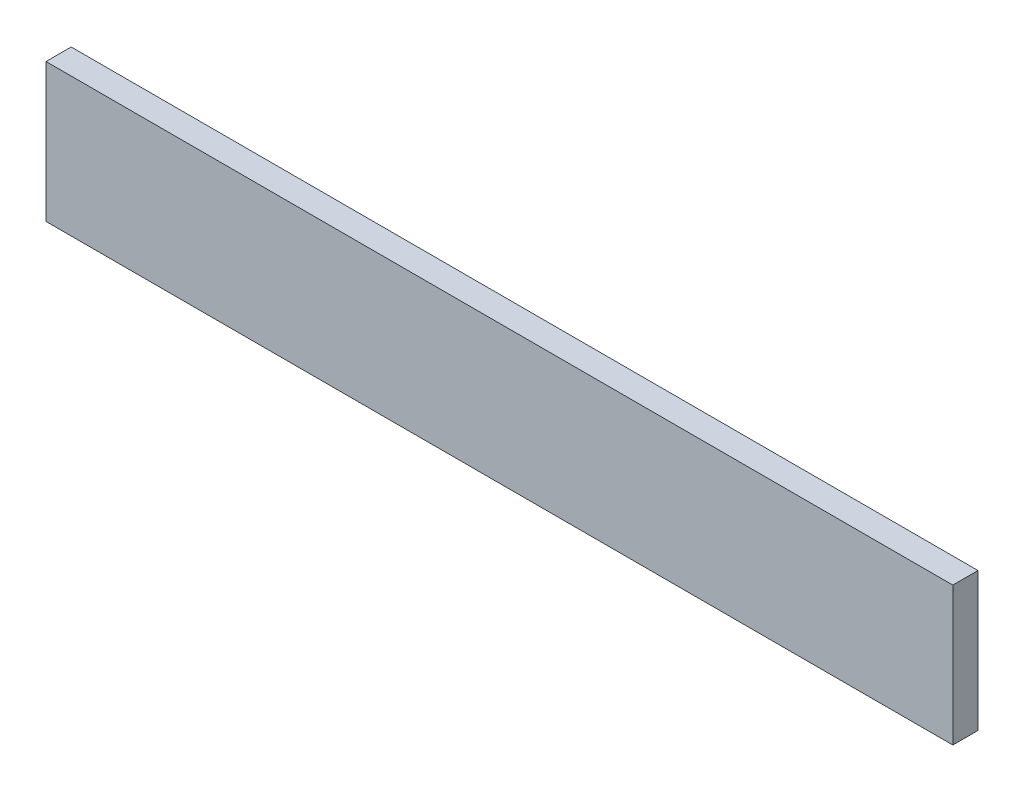
ISO-10303-21;
HEADER;
FILE_DESCRIPTION(('STEP AP214'),'2;1');
FILE_NAME('part.step','',(''),(''),'','','');
FILE_SCHEMA(('AUTOMOTIVE_DESIGN { 1 0 10303 214 1 1 1 1 }'));
ENDSEC;
DATA;
#1=APPLICATION_CONTEXT('core data for automotive mechanical design processes');
#2=APPLICATION_PROTOCOL_DEFINITION('international standard','automotive_design',2000,#1);
#3=PRODUCT_CONTEXT('',#1,'mechanical');
#4=PRODUCT('Part','Part','',(#3));
#5=PRODUCT_RELATED_PRODUCT_CATEGORY('part','',(#4));
#6=PRODUCT_DEFINITION_FORMATION('','',#4);
#7=PRODUCT_DEFINITION_CONTEXT('part definition',#1,'design');
#8=PRODUCT_DEFINITION('design','',#6,#7);
#9=PRODUCT_DEFINITION_SHAPE('','',#8);
#10=(LENGTH_UNIT() NAMED_UNIT(*) SI_UNIT(.MILLI.,.METRE.));
#11=(NAMED_UNIT(*) PLANE_ANGLE_UNIT() SI_UNIT($,.RADIAN.));
#12=(NAMED_UNIT(*) SI_UNIT($,.STERADIAN.) SOLID_ANGLE_UNIT());
#13=UNCERTAINTY_MEASURE_WITH_UNIT(LENGTH_MEASURE(1.E-05),#10,'distance_accuracy_value','');
#14=(GEOMETRIC_REPRESENTATION_CONTEXT(3) GLOBAL_UNCERTAINTY_ASSIGNED_CONTEXT((#13)) GLOBAL_UNIT_ASSIGNED_CONTEXT((#10,
#11,#12)) REPRESENTATION_CONTEXT('',''));
#15=CARTESIAN_POINT('',(0.,0.,0.));
#16=DIRECTION('',(0.,0.,1.));
#17=DIRECTION('',(1.,0.,0.));
#18=AXIS2_PLACEMENT_3D('',#15,#16,#17);
#19=CARTESIAN_POINT('',(228.6,34.925,12.7));
#20=DIRECTION('',(1.,0.,0.));
#21=DIRECTION('',(0.,1.,0.));
#22=AXIS2_PLACEMENT_3D('',#19,#20,#21);
#23=PLANE('',#22);
#24=DIRECTION('',(0.,-1.,0.));
#25=VECTOR('',#24,1.);
#26=CARTESIAN_POINT('',(228.6,34.925,0.));
#27=LINE('',#26,#25);
#28=CARTESIAN_POINT('',(228.6,34.925,0.));
#29=VERTEX_POINT('',#28);
#30=CARTESIAN_POINT('',(228.6,-34.925,0.));
#31=VERTEX_POINT('',#30);
#32=EDGE_CURVE('E98',#29,#31,#27,.T.);
#33=ORIENTED_EDGE('',*,*,#32,.F.);
#34=DIRECTION('',(0.,0.,-1.));
#35=VECTOR('',#34,1.);
#36=CARTESIAN_POINT('',(228.6,34.925,12.7));
#37=LINE('',#36,#35);
#38=CARTESIAN_POINT('',(228.6,34.925,12.7));
#39=VERTEX_POINT('',#38);
#40=EDGE_CURVE('E11',#39,#29,#37,.T.);
#41=ORIENTED_EDGE('',*,*,#40,.F.);
#42=DIRECTION('',(0.,-1.,0.));
#43=VECTOR('',#42,1.);
#44=CARTESIAN_POINT('',(228.6,34.925,12.7));
#45=LINE('',#44,#43);
#46=CARTESIAN_POINT('',(228.6,-34.925,12.7));
#47=VERTEX_POINT('',#46);
#48=EDGE_CURVE('E93',#39,#47,#45,.T.);
#49=ORIENTED_EDGE('',*,*,#48,.T.);
#50=DIRECTION('',(0.,0.,-1.));
#51=VECTOR('',#50,1.);
#52=CARTESIAN_POINT('',(228.6,-34.925,12.7));
#53=LINE('',#52,#51);
#54=EDGE_CURVE('E36',#47,#31,#53,.T.);
#55=ORIENTED_EDGE('',*,*,#54,.T.);
#56=EDGE_LOOP('',(#33,#41,#49,#55));
#57=FACE_BOUND('',#56,.T.);
#58=ADVANCED_FACE('F33',(#57),#23,.T.);
#59=CARTESIAN_POINT('',(228.6,34.925,12.7));
#60=DIRECTION('',(0.,-1.,0.));
#61=DIRECTION('',(1.,0.,0.));
#62=AXIS2_PLACEMENT_3D('',#59,#60,#61);
#63=PLANE('',#62);
#64=DIRECTION('',(-1.,0.,0.));
#65=VECTOR('',#64,1.);
#66=CARTESIAN_POINT('',(228.6,34.925,0.));
#67=LINE('',#66,#65);
#68=CARTESIAN_POINT('',(-228.6,34.925,0.));
#69=VERTEX_POINT('',#68);
#70=EDGE_CURVE('E66',#29,#69,#67,.T.);
#71=ORIENTED_EDGE('',*,*,#70,.T.);
#72=DIRECTION('',(0.,0.,-1.));
#73=VECTOR('',#72,1.);
#74=CARTESIAN_POINT('',(-228.6,34.925,12.7));
#75=LINE('',#74,#73);
#76=CARTESIAN_POINT('',(-228.6,34.925,12.7));
#77=VERTEX_POINT('',#76);
#78=EDGE_CURVE('E42',#77,#69,#75,.T.);
#79=ORIENTED_EDGE('',*,*,#78,.F.);
#80=DIRECTION('',(-1.,0.,0.));
#81=VECTOR('',#80,1.);
#82=CARTESIAN_POINT('',(228.6,34.925,12.7));
#83=LINE('',#82,#81);
#84=EDGE_CURVE('E83',#39,#77,#83,.T.);
#85=ORIENTED_EDGE('',*,*,#84,.F.);
#86=ORIENTED_EDGE('',*,*,#40,.T.);
#87=EDGE_LOOP('',(#71,#79,#85,#86));
#88=FACE_BOUND('',#87,.T.);
#89=ADVANCED_FACE('F108',(#88),#63,.F.);
#90=CARTESIAN_POINT('',(-228.6,34.925,12.7));
#91=DIRECTION('',(1.,0.,0.));
#92=DIRECTION('',(0.,0.,-1.));
#93=AXIS2_PLACEMENT_3D('',#90,#91,#92);
#94=PLANE('',#93);
#95=DIRECTION('',(0.,-1.,0.));
#96=VECTOR('',#95,1.);
#97=CARTESIAN_POINT('',(-228.6,34.925,0.));
#98=LINE('',#97,#96);
#99=CARTESIAN_POINT('',(-228.6,-34.925,0.));
#100=VERTEX_POINT('',#99);
#101=EDGE_CURVE('E90',#69,#100,#98,.T.);
#102=ORIENTED_EDGE('',*,*,#101,.T.);
#103=DIRECTION('',(0.,0.,-1.));
#104=VECTOR('',#103,1.);
#105=CARTESIAN_POINT('',(-228.6,-34.925,12.7));
#106=LINE('',#105,#104);
#107=CARTESIAN_POINT('',(-228.6,-34.925,12.7));
#108=VERTEX_POINT('',#107);
#109=EDGE_CURVE('E87',#108,#100,#106,.T.);
#110=ORIENTED_EDGE('',*,*,#109,.F.);
#111=DIRECTION('',(0.,-1.,0.));
#112=VECTOR('',#111,1.);
#113=CARTESIAN_POINT('',(-228.6,34.925,12.7));
#114=LINE('',#113,#112);
#115=EDGE_CURVE('E78',#77,#108,#114,.T.);
#116=ORIENTED_EDGE('',*,*,#115,.F.);
#117=ORIENTED_EDGE('',*,*,#78,.T.);
#118=EDGE_LOOP('',(#102,#110,#116,#117));
#119=FACE_BOUND('',#118,.T.);
#120=ADVANCED_FACE('F88',(#119),#94,.F.);
#121=CARTESIAN_POINT('',(228.6,-34.925,12.7));
#122=DIRECTION('',(0.,-1.,0.));
#123=DIRECTION('',(1.,0.,0.));
#124=AXIS2_PLACEMENT_3D('',#121,#122,#123);
#125=PLANE('',#124);
#126=DIRECTION('',(-1.,0.,0.));
#127=VECTOR('',#126,1.);
#128=CARTESIAN_POINT('',(228.6,-34.925,0.));
#129=LINE('',#128,#127);
#130=EDGE_CURVE('E101',#31,#100,#129,.T.);
#131=ORIENTED_EDGE('',*,*,#130,.F.);
#132=ORIENTED_EDGE('',*,*,#54,.F.);
#133=DIRECTION('',(-1.,0.,0.));
#134=VECTOR('',#133,1.);
#135=CARTESIAN_POINT('',(228.6,-34.925,12.7));
#136=LINE('',#135,#134);
#137=EDGE_CURVE('E82',#47,#108,#136,.T.);
#138=ORIENTED_EDGE('',*,*,#137,.T.);
#139=ORIENTED_EDGE('',*,*,#109,.T.);
#140=EDGE_LOOP('',(#131,#132,#138,#139));
#141=FACE_BOUND('',#140,.T.);
#142=ADVANCED_FACE('F92',(#141),#125,.T.);
#143=CARTESIAN_POINT('',(0.,0.,12.7));
#144=DIRECTION('',(0.,0.,-1.));
#145=DIRECTION('',(-1.,0.,0.));
#146=AXIS2_PLACEMENT_3D('',#143,#144,#145);
#147=PLANE('',#146);
#148=ORIENTED_EDGE('',*,*,#48,.F.);
#149=ORIENTED_EDGE('',*,*,#84,.T.);
#150=ORIENTED_EDGE('',*,*,#115,.T.);
#151=ORIENTED_EDGE('',*,*,#137,.F.);
#152=EDGE_LOOP('',(#148,#149,#150,#151));
#153=FACE_BOUND('',#152,.T.);
#154=ADVANCED_FACE('F81',(#153),#147,.F.);
#155=CARTESIAN_POINT('',(0.,0.,0.));
#156=DIRECTION('',(0.,0.,-1.));
#157=DIRECTION('',(-1.,0.,0.));
#158=AXIS2_PLACEMENT_3D('',#155,#156,#157);
#159=PLANE('',#158);
#160=ORIENTED_EDGE('',*,*,#32,.T.);
#161=ORIENTED_EDGE('',*,*,#130,.T.);
#162=ORIENTED_EDGE('',*,*,#101,.F.);
#163=ORIENTED_EDGE('',*,*,#70,.F.);
#164=EDGE_LOOP('',(#160,#161,#162,#163));
#165=FACE_BOUND('',#164,.T.);
#166=ADVANCED_FACE('F106',(#165),#159,.T.);
#167=CLOSED_SHELL('',(#58,#89,#120,#142,#154,#166));
#168=MANIFOLD_SOLID_BREP('B2',#167);
#169=ADVANCED_BREP_SHAPE_REPRESENTATION('',(#18,#168),#14);
#170=SHAPE_DEFINITION_REPRESENTATION(#9,#169);
ENDSEC;
END-ISO-10303-21;
